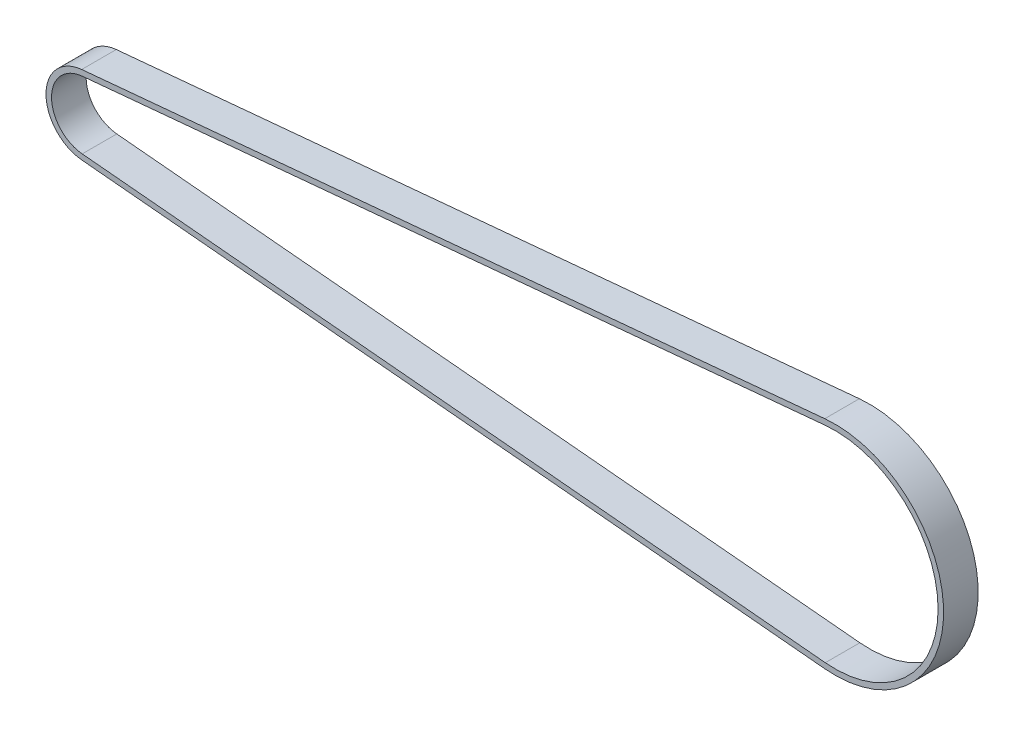
ISO-10303-21;
HEADER;
FILE_DESCRIPTION(('STEP AP214'),'2;1');
FILE_NAME('part.step','',(''),(''),'','','');
FILE_SCHEMA(('AUTOMOTIVE_DESIGN { 1 0 10303 214 1 1 1 1 }'));
ENDSEC;
DATA;
#1=APPLICATION_CONTEXT('core data for automotive mechanical design processes');
#2=APPLICATION_PROTOCOL_DEFINITION('international standard','automotive_design',2000,#1);
#3=PRODUCT_CONTEXT('',#1,'mechanical');
#4=PRODUCT('Part','Part','',(#3));
#5=PRODUCT_RELATED_PRODUCT_CATEGORY('part','',(#4));
#6=PRODUCT_DEFINITION_FORMATION('','',#4);
#7=PRODUCT_DEFINITION_CONTEXT('part definition',#1,'design');
#8=PRODUCT_DEFINITION('design','',#6,#7);
#9=PRODUCT_DEFINITION_SHAPE('','',#8);
#10=(LENGTH_UNIT() NAMED_UNIT(*) SI_UNIT(.MILLI.,.METRE.));
#11=(NAMED_UNIT(*) PLANE_ANGLE_UNIT() SI_UNIT($,.RADIAN.));
#12=(NAMED_UNIT(*) SI_UNIT($,.STERADIAN.) SOLID_ANGLE_UNIT());
#13=UNCERTAINTY_MEASURE_WITH_UNIT(LENGTH_MEASURE(1.E-05),#10,'distance_accuracy_value','');
#14=(GEOMETRIC_REPRESENTATION_CONTEXT(3) GLOBAL_UNCERTAINTY_ASSIGNED_CONTEXT((#13)) GLOBAL_UNIT_ASSIGNED_CONTEXT((#10,
#11,#12)) REPRESENTATION_CONTEXT('',''));
#15=CARTESIAN_POINT('',(0.,0.,0.));
#16=DIRECTION('',(0.,0.,1.));
#17=DIRECTION('',(1.,0.,0.));
#18=AXIS2_PLACEMENT_3D('',#15,#16,#17);
#19=CARTESIAN_POINT('',(0.,0.,6.35));
#20=DIRECTION('',(0.,0.,-1.));
#21=DIRECTION('',(-1.,0.,0.));
#22=AXIS2_PLACEMENT_3D('',#19,#20,#21);
#23=PLANE('',#22);
#24=CARTESIAN_POINT('',(0.,0.,6.35));
#25=DIRECTION('',(0.,0.,-1.));
#26=DIRECTION('',(-1.,0.,0.));
#27=AXIS2_PLACEMENT_3D('',#24,#25,#26);
#28=CIRCLE('',#27,7.2263);
#29=CARTESIAN_POINT('',(-0.669299372693727,7.19523801133165,6.35));
#30=VERTEX_POINT('',#29);
#31=CARTESIAN_POINT('',(-0.669299372693727,-7.19523801133165,6.35));
#32=VERTEX_POINT('',#31);
#33=EDGE_CURVE('E158',#30,#32,#28,.F.);
#34=ORIENTED_EDGE('',*,*,#33,.T.);
#35=DIRECTION('',(0.995701536240074,-0.092619926199262,0.));
#36=VECTOR('',#35,1.);
#37=CARTESIAN_POINT('',(-0.669299372693728,-7.19523801133165,6.35));
#38=LINE('',#37,#36);
#39=CARTESIAN_POINT('',(135.817722472325,-19.8912291596216,6.35));
#40=VERTEX_POINT('',#39);
#41=EDGE_CURVE('E161',#32,#40,#38,.T.);
#42=ORIENTED_EDGE('',*,*,#41,.T.);
#43=CARTESIAN_POINT('',(137.668,0.,6.35));
#44=DIRECTION('',(0.,0.,-1.));
#45=DIRECTION('',(-1.,0.,0.));
#46=AXIS2_PLACEMENT_3D('',#43,#44,#45);
#47=CIRCLE('',#46,19.9771);
#48=CARTESIAN_POINT('',(135.817722472325,19.8912291596216,6.35));
#49=VERTEX_POINT('',#48);
#50=EDGE_CURVE('E164',#40,#49,#47,.F.);
#51=ORIENTED_EDGE('',*,*,#50,.T.);
#52=DIRECTION('',(-0.995701536240074,-0.092619926199262,0.));
#53=VECTOR('',#52,1.);
#54=CARTESIAN_POINT('',(-0.669299372693727,7.19523801133165,6.35));
#55=LINE('',#54,#53);
#56=EDGE_CURVE('E166',#49,#30,#55,.T.);
#57=ORIENTED_EDGE('',*,*,#56,.T.);
#58=EDGE_LOOP('',(#34,#42,#51,#57));
#59=FACE_BOUND('',#58,.T.);
#60=CARTESIAN_POINT('',(0.,0.,6.35));
#61=DIRECTION('',(0.,0.,1.));
#62=DIRECTION('',(-1.,0.,0.));
#63=AXIS2_PLACEMENT_3D('',#60,#61,#62);
#64=CIRCLE('',#63,6.2103);
#65=CARTESIAN_POINT('',(-0.575197527675277,6.18360525051173,6.35));
#66=VERTEX_POINT('',#65);
#67=CARTESIAN_POINT('',(-0.575197527675277,-6.18360525051173,6.35));
#68=VERTEX_POINT('',#67);
#69=EDGE_CURVE('E122',#66,#68,#64,.T.);
#70=ORIENTED_EDGE('',*,*,#69,.F.);
#71=DIRECTION('',(-0.995701536240074,-0.092619926199262,0.));
#72=VECTOR('',#71,1.);
#73=CARTESIAN_POINT('',(-0.575197527675277,6.18360525051173,6.35));
#74=LINE('',#73,#72);
#75=CARTESIAN_POINT('',(135.911824317343,18.8795963988017,6.35));
#76=VERTEX_POINT('',#75);
#77=EDGE_CURVE('E144',#76,#66,#74,.T.);
#78=ORIENTED_EDGE('',*,*,#77,.F.);
#79=CARTESIAN_POINT('',(137.668,0.,6.35));
#80=DIRECTION('',(0.,0.,1.));
#81=DIRECTION('',(-1.,0.,0.));
#82=AXIS2_PLACEMENT_3D('',#79,#80,#81);
#83=CIRCLE('',#82,18.9611);
#84=CARTESIAN_POINT('',(135.911824317343,-18.8795963988017,6.35));
#85=VERTEX_POINT('',#84);
#86=EDGE_CURVE('E142',#85,#76,#83,.T.);
#87=ORIENTED_EDGE('',*,*,#86,.F.);
#88=DIRECTION('',(0.995701536240074,-0.092619926199262,0.));
#89=VECTOR('',#88,1.);
#90=CARTESIAN_POINT('',(-0.575197527675277,-6.18360525051173,6.35));
#91=LINE('',#90,#89);
#92=EDGE_CURVE('E130',#68,#85,#91,.T.);
#93=ORIENTED_EDGE('',*,*,#92,.F.);
#94=EDGE_LOOP('',(#70,#78,#87,#93));
#95=FACE_BOUND('',#94,.T.);
#96=ADVANCED_FACE('F57',(#59,#95),#23,.F.);
#97=CARTESIAN_POINT('',(0.,0.,0.));
#98=DIRECTION('',(0.,0.,-1.));
#99=DIRECTION('',(-1.,0.,0.));
#100=AXIS2_PLACEMENT_3D('',#97,#98,#99);
#101=PLANE('',#100);
#102=CARTESIAN_POINT('',(0.,0.,0.));
#103=DIRECTION('',(0.,0.,-1.));
#104=DIRECTION('',(-1.,0.,0.));
#105=AXIS2_PLACEMENT_3D('',#102,#103,#104);
#106=CIRCLE('',#105,7.2263);
#107=CARTESIAN_POINT('',(-0.669299372693727,7.19523801133165,0.));
#108=VERTEX_POINT('',#107);
#109=CARTESIAN_POINT('',(-0.669299372693727,-7.19523801133165,0.));
#110=VERTEX_POINT('',#109);
#111=EDGE_CURVE('E138',#108,#110,#106,.F.);
#112=ORIENTED_EDGE('',*,*,#111,.F.);
#113=DIRECTION('',(-0.995701536240074,-0.092619926199262,0.));
#114=VECTOR('',#113,1.);
#115=CARTESIAN_POINT('',(-0.669299372693727,7.19523801133165,0.));
#116=LINE('',#115,#114);
#117=CARTESIAN_POINT('',(135.817722472325,19.8912291596216,0.));
#118=VERTEX_POINT('',#117);
#119=EDGE_CURVE('E162',#118,#108,#116,.T.);
#120=ORIENTED_EDGE('',*,*,#119,.F.);
#121=CARTESIAN_POINT('',(137.668,0.,0.));
#122=DIRECTION('',(0.,0.,-1.));
#123=DIRECTION('',(-1.,0.,0.));
#124=AXIS2_PLACEMENT_3D('',#121,#122,#123);
#125=CIRCLE('',#124,19.9771);
#126=CARTESIAN_POINT('',(135.817722472325,-19.8912291596216,0.));
#127=VERTEX_POINT('',#126);
#128=EDGE_CURVE('E173',#127,#118,#125,.F.);
#129=ORIENTED_EDGE('',*,*,#128,.F.);
#130=DIRECTION('',(0.995701536240074,-0.092619926199262,0.));
#131=VECTOR('',#130,1.);
#132=CARTESIAN_POINT('',(-0.669299372693728,-7.19523801133165,0.));
#133=LINE('',#132,#131);
#134=EDGE_CURVE('E171',#110,#127,#133,.T.);
#135=ORIENTED_EDGE('',*,*,#134,.F.);
#136=EDGE_LOOP('',(#112,#120,#129,#135));
#137=FACE_BOUND('',#136,.T.);
#138=DIRECTION('',(-0.995701536240074,-0.092619926199262,0.));
#139=VECTOR('',#138,1.);
#140=CARTESIAN_POINT('',(-0.575197527675277,6.18360525051173,0.));
#141=LINE('',#140,#139);
#142=CARTESIAN_POINT('',(135.911824317343,18.8795963988017,0.));
#143=VERTEX_POINT('',#142);
#144=CARTESIAN_POINT('',(-0.575197527675277,6.18360525051173,0.));
#145=VERTEX_POINT('',#144);
#146=EDGE_CURVE('E131',#143,#145,#141,.T.);
#147=ORIENTED_EDGE('',*,*,#146,.T.);
#148=CARTESIAN_POINT('',(0.,0.,0.));
#149=DIRECTION('',(0.,0.,1.));
#150=DIRECTION('',(-1.,0.,0.));
#151=AXIS2_PLACEMENT_3D('',#148,#149,#150);
#152=CIRCLE('',#151,6.2103);
#153=CARTESIAN_POINT('',(-0.575197527675277,-6.18360525051173,0.));
#154=VERTEX_POINT('',#153);
#155=EDGE_CURVE('E80',#145,#154,#152,.T.);
#156=ORIENTED_EDGE('',*,*,#155,.T.);
#157=DIRECTION('',(0.995701536240074,-0.092619926199262,0.));
#158=VECTOR('',#157,1.);
#159=CARTESIAN_POINT('',(-0.575197527675277,-6.18360525051173,0.));
#160=LINE('',#159,#158);
#161=CARTESIAN_POINT('',(135.911824317343,-18.8795963988017,0.));
#162=VERTEX_POINT('',#161);
#163=EDGE_CURVE('E137',#154,#162,#160,.T.);
#164=ORIENTED_EDGE('',*,*,#163,.T.);
#165=CARTESIAN_POINT('',(137.668,0.,0.));
#166=DIRECTION('',(0.,0.,1.));
#167=DIRECTION('',(-1.,0.,0.));
#168=AXIS2_PLACEMENT_3D('',#165,#166,#167);
#169=CIRCLE('',#168,18.9611);
#170=EDGE_CURVE('E150',#162,#143,#169,.T.);
#171=ORIENTED_EDGE('',*,*,#170,.T.);
#172=EDGE_LOOP('',(#147,#156,#164,#171));
#173=FACE_BOUND('',#172,.T.);
#174=ADVANCED_FACE('F191',(#137,#173),#101,.T.);
#175=CARTESIAN_POINT('',(0.,0.,6.35));
#176=DIRECTION('',(0.,0.,-1.));
#177=DIRECTION('',(-1.,0.,0.));
#178=AXIS2_PLACEMENT_3D('',#175,#176,#177);
#179=CYLINDRICAL_SURFACE('',#178,7.2263);
#180=ORIENTED_EDGE('',*,*,#111,.T.);
#181=DIRECTION('',(0.,0.,-1.));
#182=VECTOR('',#181,1.);
#183=CARTESIAN_POINT('',(-0.669299372693727,-7.19523801133165,6.35));
#184=LINE('',#183,#182);
#185=EDGE_CURVE('E12',#32,#110,#184,.T.);
#186=ORIENTED_EDGE('',*,*,#185,.F.);
#187=ORIENTED_EDGE('',*,*,#33,.F.);
#188=DIRECTION('',(0.,0.,-1.));
#189=VECTOR('',#188,1.);
#190=CARTESIAN_POINT('',(-0.669299372693727,7.19523801133165,6.35));
#191=LINE('',#190,#189);
#192=EDGE_CURVE('E168',#30,#108,#191,.T.);
#193=ORIENTED_EDGE('',*,*,#192,.T.);
#194=EDGE_LOOP('',(#180,#186,#187,#193));
#195=FACE_BOUND('',#194,.T.);
#196=ADVANCED_FACE('F59',(#195),#179,.T.);
#197=CARTESIAN_POINT('',(-0.669299372693728,-7.19523801133165,6.35));
#198=DIRECTION('',(0.092619926199262,0.995701536240074,0.));
#199=DIRECTION('',(-0.995701536240074,0.092619926199262,0.));
#200=AXIS2_PLACEMENT_3D('',#197,#198,#199);
#201=PLANE('',#200);
#202=ORIENTED_EDGE('',*,*,#134,.T.);
#203=DIRECTION('',(0.,0.,-1.));
#204=VECTOR('',#203,1.);
#205=CARTESIAN_POINT('',(135.817722472325,-19.8912291596216,6.35));
#206=LINE('',#205,#204);
#207=EDGE_CURVE('E65',#40,#127,#206,.T.);
#208=ORIENTED_EDGE('',*,*,#207,.F.);
#209=ORIENTED_EDGE('',*,*,#41,.F.);
#210=ORIENTED_EDGE('',*,*,#185,.T.);
#211=EDGE_LOOP('',(#202,#208,#209,#210));
#212=FACE_BOUND('',#211,.T.);
#213=ADVANCED_FACE('F201',(#212),#201,.F.);
#214=CARTESIAN_POINT('',(137.668,0.,6.35));
#215=DIRECTION('',(0.,0.,-1.));
#216=DIRECTION('',(-1.,0.,0.));
#217=AXIS2_PLACEMENT_3D('',#214,#215,#216);
#218=CYLINDRICAL_SURFACE('',#217,19.9771);
#219=ORIENTED_EDGE('',*,*,#128,.T.);
#220=DIRECTION('',(0.,0.,-1.));
#221=VECTOR('',#220,1.);
#222=CARTESIAN_POINT('',(135.817722472325,19.8912291596216,6.35));
#223=LINE('',#222,#221);
#224=EDGE_CURVE('E178',#49,#118,#223,.T.);
#225=ORIENTED_EDGE('',*,*,#224,.F.);
#226=ORIENTED_EDGE('',*,*,#50,.F.);
#227=ORIENTED_EDGE('',*,*,#207,.T.);
#228=EDGE_LOOP('',(#219,#225,#226,#227));
#229=FACE_BOUND('',#228,.T.);
#230=ADVANCED_FACE('F185',(#229),#218,.T.);
#231=CARTESIAN_POINT('',(-0.669299372693727,7.19523801133165,6.35));
#232=DIRECTION('',(0.092619926199262,-0.995701536240074,0.));
#233=DIRECTION('',(0.995701536240074,0.092619926199262,0.));
#234=AXIS2_PLACEMENT_3D('',#231,#232,#233);
#235=PLANE('',#234);
#236=ORIENTED_EDGE('',*,*,#119,.T.);
#237=ORIENTED_EDGE('',*,*,#192,.F.);
#238=ORIENTED_EDGE('',*,*,#56,.F.);
#239=ORIENTED_EDGE('',*,*,#224,.T.);
#240=EDGE_LOOP('',(#236,#237,#238,#239));
#241=FACE_BOUND('',#240,.T.);
#242=ADVANCED_FACE('F195',(#241),#235,.F.);
#243=CARTESIAN_POINT('',(0.,0.,6.35));
#244=DIRECTION('',(0.,0.,-1.));
#245=DIRECTION('',(-1.,0.,0.));
#246=AXIS2_PLACEMENT_3D('',#243,#244,#245);
#247=CYLINDRICAL_SURFACE('',#246,6.2103);
#248=ORIENTED_EDGE('',*,*,#155,.F.);
#249=DIRECTION('',(0.,0.,-1.));
#250=VECTOR('',#249,1.);
#251=CARTESIAN_POINT('',(-0.575197527675277,6.18360525051173,6.35));
#252=LINE('',#251,#250);
#253=EDGE_CURVE('E126',#66,#145,#252,.T.);
#254=ORIENTED_EDGE('',*,*,#253,.F.);
#255=ORIENTED_EDGE('',*,*,#69,.T.);
#256=DIRECTION('',(0.,0.,-1.));
#257=VECTOR('',#256,1.);
#258=CARTESIAN_POINT('',(-0.575197527675277,-6.18360525051173,6.35));
#259=LINE('',#258,#257);
#260=EDGE_CURVE('E125',#68,#154,#259,.T.);
#261=ORIENTED_EDGE('',*,*,#260,.T.);
#262=EDGE_LOOP('',(#248,#254,#255,#261));
#263=FACE_BOUND('',#262,.T.);
#264=ADVANCED_FACE('F124',(#263),#247,.F.);
#265=CARTESIAN_POINT('',(-0.575197527675277,-6.18360525051173,6.35));
#266=DIRECTION('',(0.092619926199262,0.995701536240074,0.));
#267=DIRECTION('',(-0.995701536240074,0.092619926199262,0.));
#268=AXIS2_PLACEMENT_3D('',#265,#266,#267);
#269=PLANE('',#268);
#270=ORIENTED_EDGE('',*,*,#163,.F.);
#271=ORIENTED_EDGE('',*,*,#260,.F.);
#272=ORIENTED_EDGE('',*,*,#92,.T.);
#273=DIRECTION('',(0.,0.,-1.));
#274=VECTOR('',#273,1.);
#275=CARTESIAN_POINT('',(135.911824317343,-18.8795963988017,6.35));
#276=LINE('',#275,#274);
#277=EDGE_CURVE('E139',#85,#162,#276,.T.);
#278=ORIENTED_EDGE('',*,*,#277,.T.);
#279=EDGE_LOOP('',(#270,#271,#272,#278));
#280=FACE_BOUND('',#279,.T.);
#281=ADVANCED_FACE('F134',(#280),#269,.T.);
#282=CARTESIAN_POINT('',(137.668,0.,6.35));
#283=DIRECTION('',(0.,0.,-1.));
#284=DIRECTION('',(-1.,0.,0.));
#285=AXIS2_PLACEMENT_3D('',#282,#283,#284);
#286=CYLINDRICAL_SURFACE('',#285,18.9611);
#287=ORIENTED_EDGE('',*,*,#170,.F.);
#288=ORIENTED_EDGE('',*,*,#277,.F.);
#289=ORIENTED_EDGE('',*,*,#86,.T.);
#290=DIRECTION('',(0.,0.,-1.));
#291=VECTOR('',#290,1.);
#292=CARTESIAN_POINT('',(135.911824317343,18.8795963988017,6.35));
#293=LINE('',#292,#291);
#294=EDGE_CURVE('E72',#76,#143,#293,.T.);
#295=ORIENTED_EDGE('',*,*,#294,.T.);
#296=EDGE_LOOP('',(#287,#288,#289,#295));
#297=FACE_BOUND('',#296,.T.);
#298=ADVANCED_FACE('F224',(#297),#286,.F.);
#299=CARTESIAN_POINT('',(-0.575197527675277,6.18360525051173,6.35));
#300=DIRECTION('',(0.092619926199262,-0.995701536240074,0.));
#301=DIRECTION('',(0.995701536240074,0.092619926199262,0.));
#302=AXIS2_PLACEMENT_3D('',#299,#300,#301);
#303=PLANE('',#302);
#304=ORIENTED_EDGE('',*,*,#146,.F.);
#305=ORIENTED_EDGE('',*,*,#294,.F.);
#306=ORIENTED_EDGE('',*,*,#77,.T.);
#307=ORIENTED_EDGE('',*,*,#253,.T.);
#308=EDGE_LOOP('',(#304,#305,#306,#307));
#309=FACE_BOUND('',#308,.T.);
#310=ADVANCED_FACE('F228',(#309),#303,.T.);
#311=CLOSED_SHELL('',(#96,#174,#196,#213,#230,#242,#264,#281,#298,#310));
#312=MANIFOLD_SOLID_BREP('B2',#311);
#313=ADVANCED_BREP_SHAPE_REPRESENTATION('',(#18,#312),#14);
#314=SHAPE_DEFINITION_REPRESENTATION(#9,#313);
ENDSEC;
END-ISO-10303-21;
